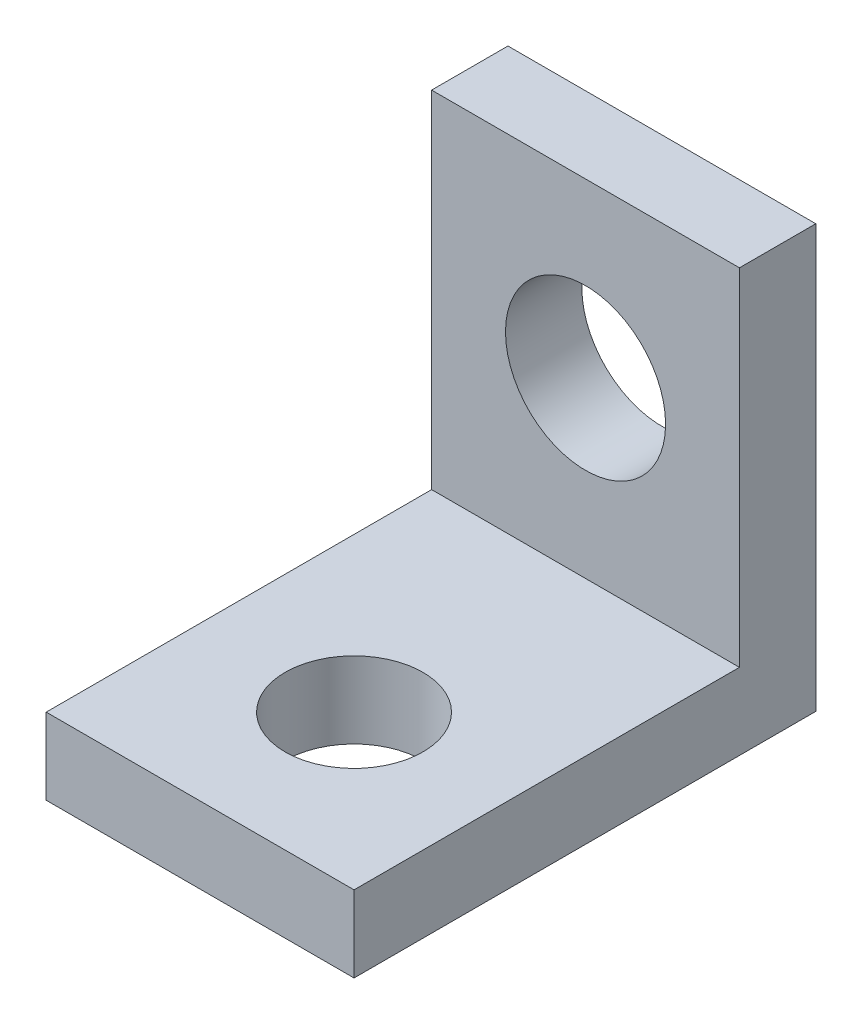
ISO-10303-21;
HEADER;
FILE_DESCRIPTION(('STEP AP214'),'2;1');
FILE_NAME('part.step','',(''),(''),'','','');
FILE_SCHEMA(('AUTOMOTIVE_DESIGN { 1 0 10303 214 1 1 1 1 }'));
ENDSEC;
DATA;
#1=APPLICATION_CONTEXT('core data for automotive mechanical design processes');
#2=APPLICATION_PROTOCOL_DEFINITION('international standard','automotive_design',2000,#1);
#3=PRODUCT_CONTEXT('',#1,'mechanical');
#4=PRODUCT('Part','Part','',(#3));
#5=PRODUCT_RELATED_PRODUCT_CATEGORY('part','',(#4));
#6=PRODUCT_DEFINITION_FORMATION('','',#4);
#7=PRODUCT_DEFINITION_CONTEXT('part definition',#1,'design');
#8=PRODUCT_DEFINITION('design','',#6,#7);
#9=PRODUCT_DEFINITION_SHAPE('','',#8);
#10=(LENGTH_UNIT() NAMED_UNIT(*) SI_UNIT(.MILLI.,.METRE.));
#11=(NAMED_UNIT(*) PLANE_ANGLE_UNIT() SI_UNIT($,.RADIAN.));
#12=(NAMED_UNIT(*) SI_UNIT($,.STERADIAN.) SOLID_ANGLE_UNIT());
#13=UNCERTAINTY_MEASURE_WITH_UNIT(LENGTH_MEASURE(1.E-05),#10,'distance_accuracy_value','');
#14=(GEOMETRIC_REPRESENTATION_CONTEXT(3) GLOBAL_UNCERTAINTY_ASSIGNED_CONTEXT((#13)) GLOBAL_UNIT_ASSIGNED_CONTEXT((#10,
#11,#12)) REPRESENTATION_CONTEXT('',''));
#15=CARTESIAN_POINT('',(0.,0.,0.));
#16=DIRECTION('',(0.,0.,1.));
#17=DIRECTION('',(1.,0.,0.));
#18=AXIS2_PLACEMENT_3D('',#15,#16,#17);
#19=CARTESIAN_POINT('',(-6.35,0.,9.525));
#20=DIRECTION('',(0.,-1.,0.));
#21=DIRECTION('',(0.,0.,-1.));
#22=AXIS2_PLACEMENT_3D('',#19,#20,#21);
#23=PLANE('',#22);
#24=CARTESIAN_POINT('',(-3.175,0.,6.35));
#25=DIRECTION('',(0.,-1.,0.));
#26=DIRECTION('',(0.,0.,-1.));
#27=AXIS2_PLACEMENT_3D('',#24,#25,#26);
#28=CIRCLE('',#27,1.4224);
#29=CARTESIAN_POINT('',(-3.175,0.,7.7724));
#30=VERTEX_POINT('',#29);
#31=EDGE_CURVE('E176',#30,#30,#28,.F.);
#32=ORIENTED_EDGE('',*,*,#31,.T.);
#33=EDGE_LOOP('',(#32));
#34=FACE_BOUND('',#33,.T.);
#35=DIRECTION('',(0.,0.,-1.));
#36=VECTOR('',#35,1.);
#37=CARTESIAN_POINT('',(0.,0.,9.525));
#38=LINE('',#37,#36);
#39=CARTESIAN_POINT('',(0.,0.,9.525));
#40=VERTEX_POINT('',#39);
#41=CARTESIAN_POINT('',(0.,0.,0.));
#42=VERTEX_POINT('',#41);
#43=EDGE_CURVE('E120',#40,#42,#38,.T.);
#44=ORIENTED_EDGE('',*,*,#43,.F.);
#45=DIRECTION('',(1.,0.,0.));
#46=VECTOR('',#45,1.);
#47=CARTESIAN_POINT('',(-6.35,0.,9.525));
#48=LINE('',#47,#46);
#49=CARTESIAN_POINT('',(-6.35,0.,9.525));
#50=VERTEX_POINT('',#49);
#51=EDGE_CURVE('E11',#50,#40,#48,.T.);
#52=ORIENTED_EDGE('',*,*,#51,.F.);
#53=DIRECTION('',(0.,0.,-1.));
#54=VECTOR('',#53,1.);
#55=CARTESIAN_POINT('',(-6.35,0.,9.525));
#56=LINE('',#55,#54);
#57=CARTESIAN_POINT('',(-6.35,0.,0.));
#58=VERTEX_POINT('',#57);
#59=EDGE_CURVE('E135',#50,#58,#56,.T.);
#60=ORIENTED_EDGE('',*,*,#59,.T.);
#61=DIRECTION('',(1.,0.,0.));
#62=VECTOR('',#61,1.);
#63=CARTESIAN_POINT('',(-6.35,0.,0.));
#64=LINE('',#63,#62);
#65=EDGE_CURVE('E38',#58,#42,#64,.T.);
#66=ORIENTED_EDGE('',*,*,#65,.T.);
#67=EDGE_LOOP('',(#44,#52,#60,#66));
#68=FACE_BOUND('',#67,.T.);
#69=ADVANCED_FACE('F35',(#34,#68),#23,.T.);
#70=CARTESIAN_POINT('',(-6.35,1.5748,9.525));
#71=DIRECTION('',(0.,0.,1.));
#72=DIRECTION('',(1.,0.,0.));
#73=AXIS2_PLACEMENT_3D('',#70,#71,#72);
#74=PLANE('',#73);
#75=DIRECTION('',(0.,-1.,0.));
#76=VECTOR('',#75,1.);
#77=CARTESIAN_POINT('',(0.,1.5748,9.525));
#78=LINE('',#77,#76);
#79=CARTESIAN_POINT('',(0.,1.5748,9.525));
#80=VERTEX_POINT('',#79);
#81=EDGE_CURVE('E133',#80,#40,#78,.T.);
#82=ORIENTED_EDGE('',*,*,#81,.F.);
#83=DIRECTION('',(1.,0.,0.));
#84=VECTOR('',#83,1.);
#85=CARTESIAN_POINT('',(-6.35,1.5748,9.525));
#86=LINE('',#85,#84);
#87=CARTESIAN_POINT('',(-6.35,1.5748,9.525));
#88=VERTEX_POINT('',#87);
#89=EDGE_CURVE('E44',#88,#80,#86,.T.);
#90=ORIENTED_EDGE('',*,*,#89,.F.);
#91=DIRECTION('',(0.,-1.,0.));
#92=VECTOR('',#91,1.);
#93=CARTESIAN_POINT('',(-6.35,1.5748,9.525));
#94=LINE('',#93,#92);
#95=EDGE_CURVE('E110',#88,#50,#94,.T.);
#96=ORIENTED_EDGE('',*,*,#95,.T.);
#97=ORIENTED_EDGE('',*,*,#51,.T.);
#98=EDGE_LOOP('',(#82,#90,#96,#97));
#99=FACE_BOUND('',#98,.T.);
#100=ADVANCED_FACE('F143',(#99),#74,.T.);
#101=CARTESIAN_POINT('',(-6.35,1.5748,1.5748));
#102=DIRECTION('',(0.,1.,0.));
#103=DIRECTION('',(0.,0.,1.));
#104=AXIS2_PLACEMENT_3D('',#101,#102,#103);
#105=PLANE('',#104);
#106=CARTESIAN_POINT('',(-3.175,1.5748,6.35));
#107=DIRECTION('',(0.,1.,0.));
#108=DIRECTION('',(0.,0.,1.));
#109=AXIS2_PLACEMENT_3D('',#106,#107,#108);
#110=CIRCLE('',#109,1.4224);
#111=CARTESIAN_POINT('',(-3.175,1.5748,7.7724));
#112=VERTEX_POINT('',#111);
#113=EDGE_CURVE('E171',#112,#112,#110,.T.);
#114=ORIENTED_EDGE('',*,*,#113,.F.);
#115=EDGE_LOOP('',(#114));
#116=FACE_BOUND('',#115,.T.);
#117=DIRECTION('',(0.,0.,1.));
#118=VECTOR('',#117,1.);
#119=CARTESIAN_POINT('',(0.,1.5748,1.5748));
#120=LINE('',#119,#118);
#121=CARTESIAN_POINT('',(0.,1.5748,1.5748));
#122=VERTEX_POINT('',#121);
#123=EDGE_CURVE('E97',#122,#80,#120,.T.);
#124=ORIENTED_EDGE('',*,*,#123,.F.);
#125=DIRECTION('',(1.,0.,0.));
#126=VECTOR('',#125,1.);
#127=CARTESIAN_POINT('',(-6.35,1.5748,1.5748));
#128=LINE('',#127,#126);
#129=CARTESIAN_POINT('',(-6.35,1.5748,1.5748));
#130=VERTEX_POINT('',#129);
#131=EDGE_CURVE('E92',#130,#122,#128,.T.);
#132=ORIENTED_EDGE('',*,*,#131,.F.);
#133=DIRECTION('',(0.,0.,1.));
#134=VECTOR('',#133,1.);
#135=CARTESIAN_POINT('',(-6.35,1.5748,1.5748));
#136=LINE('',#135,#134);
#137=EDGE_CURVE('E95',#130,#88,#136,.T.);
#138=ORIENTED_EDGE('',*,*,#137,.T.);
#139=ORIENTED_EDGE('',*,*,#89,.T.);
#140=EDGE_LOOP('',(#124,#132,#138,#139));
#141=FACE_BOUND('',#140,.T.);
#142=ADVANCED_FACE('F94',(#116,#141),#105,.T.);
#143=CARTESIAN_POINT('',(-6.35,8.7122,1.5748));
#144=DIRECTION('',(0.,0.,1.));
#145=DIRECTION('',(0.,-1.,0.));
#146=AXIS2_PLACEMENT_3D('',#143,#144,#145);
#147=PLANE('',#146);
#148=CARTESIAN_POINT('',(-3.175,5.1562,1.5748));
#149=DIRECTION('',(0.,0.,1.));
#150=DIRECTION('',(1.,0.,0.));
#151=AXIS2_PLACEMENT_3D('',#148,#149,#150);
#152=CIRCLE('',#151,1.651);
#153=CARTESIAN_POINT('',(-1.524,5.1562,1.5748));
#154=VERTEX_POINT('',#153);
#155=EDGE_CURVE('E124',#154,#154,#152,.T.);
#156=ORIENTED_EDGE('',*,*,#155,.F.);
#157=EDGE_LOOP('',(#156));
#158=FACE_BOUND('',#157,.T.);
#159=DIRECTION('',(0.,-1.,0.));
#160=VECTOR('',#159,1.);
#161=CARTESIAN_POINT('',(0.,8.7122,1.5748));
#162=LINE('',#161,#160);
#163=CARTESIAN_POINT('',(0.,8.7122,1.5748));
#164=VERTEX_POINT('',#163);
#165=EDGE_CURVE('E130',#164,#122,#162,.T.);
#166=ORIENTED_EDGE('',*,*,#165,.F.);
#167=DIRECTION('',(1.,0.,0.));
#168=VECTOR('',#167,1.);
#169=CARTESIAN_POINT('',(-6.35,8.7122,1.5748));
#170=LINE('',#169,#168);
#171=CARTESIAN_POINT('',(-6.35,8.7122,1.5748));
#172=VERTEX_POINT('',#171);
#173=EDGE_CURVE('E102',#172,#164,#170,.T.);
#174=ORIENTED_EDGE('',*,*,#173,.F.);
#175=DIRECTION('',(0.,-1.,0.));
#176=VECTOR('',#175,1.);
#177=CARTESIAN_POINT('',(-6.35,8.7122,1.5748));
#178=LINE('',#177,#176);
#179=EDGE_CURVE('E108',#172,#130,#178,.T.);
#180=ORIENTED_EDGE('',*,*,#179,.T.);
#181=ORIENTED_EDGE('',*,*,#131,.T.);
#182=EDGE_LOOP('',(#166,#174,#180,#181));
#183=FACE_BOUND('',#182,.T.);
#184=ADVANCED_FACE('F112',(#158,#183),#147,.T.);
#185=CARTESIAN_POINT('',(-6.35,8.7122,0.));
#186=DIRECTION('',(0.,1.,0.));
#187=DIRECTION('',(0.,0.,1.));
#188=AXIS2_PLACEMENT_3D('',#185,#186,#187);
#189=PLANE('',#188);
#190=DIRECTION('',(0.,0.,1.));
#191=VECTOR('',#190,1.);
#192=CARTESIAN_POINT('',(0.,8.7122,0.));
#193=LINE('',#192,#191);
#194=CARTESIAN_POINT('',(0.,8.7122,0.));
#195=VERTEX_POINT('',#194);
#196=EDGE_CURVE('E127',#195,#164,#193,.T.);
#197=ORIENTED_EDGE('',*,*,#196,.F.);
#198=DIRECTION('',(1.,0.,0.));
#199=VECTOR('',#198,1.);
#200=CARTESIAN_POINT('',(-6.35,8.7122,0.));
#201=LINE('',#200,#199);
#202=CARTESIAN_POINT('',(-6.35,8.7122,0.));
#203=VERTEX_POINT('',#202);
#204=EDGE_CURVE('E138',#203,#195,#201,.T.);
#205=ORIENTED_EDGE('',*,*,#204,.F.);
#206=DIRECTION('',(0.,0.,1.));
#207=VECTOR('',#206,1.);
#208=CARTESIAN_POINT('',(-6.35,8.7122,0.));
#209=LINE('',#208,#207);
#210=EDGE_CURVE('E113',#203,#172,#209,.T.);
#211=ORIENTED_EDGE('',*,*,#210,.T.);
#212=ORIENTED_EDGE('',*,*,#173,.T.);
#213=EDGE_LOOP('',(#197,#205,#211,#212));
#214=FACE_BOUND('',#213,.T.);
#215=ADVANCED_FACE('F158',(#214),#189,.T.);
#216=CARTESIAN_POINT('',(-6.35,0.,0.));
#217=DIRECTION('',(0.,0.,-1.));
#218=DIRECTION('',(-1.,0.,0.));
#219=AXIS2_PLACEMENT_3D('',#216,#217,#218);
#220=PLANE('',#219);
#221=CARTESIAN_POINT('',(-3.175,5.1562,0.));
#222=DIRECTION('',(0.,0.,-1.));
#223=DIRECTION('',(-1.,0.,0.));
#224=AXIS2_PLACEMENT_3D('',#221,#222,#223);
#225=CIRCLE('',#224,1.651);
#226=CARTESIAN_POINT('',(-4.826,5.1562,0.));
#227=VERTEX_POINT('',#226);
#228=EDGE_CURVE('E169',#227,#227,#225,.F.);
#229=ORIENTED_EDGE('',*,*,#228,.T.);
#230=EDGE_LOOP('',(#229));
#231=FACE_BOUND('',#230,.T.);
#232=DIRECTION('',(0.,1.,0.));
#233=VECTOR('',#232,1.);
#234=CARTESIAN_POINT('',(0.,0.,0.));
#235=LINE('',#234,#233);
#236=EDGE_CURVE('E123',#42,#195,#235,.T.);
#237=ORIENTED_EDGE('',*,*,#236,.F.);
#238=ORIENTED_EDGE('',*,*,#65,.F.);
#239=DIRECTION('',(0.,1.,0.));
#240=VECTOR('',#239,1.);
#241=CARTESIAN_POINT('',(-6.35,0.,0.));
#242=LINE('',#241,#240);
#243=EDGE_CURVE('E115',#58,#203,#242,.T.);
#244=ORIENTED_EDGE('',*,*,#243,.T.);
#245=ORIENTED_EDGE('',*,*,#204,.T.);
#246=EDGE_LOOP('',(#237,#238,#244,#245));
#247=FACE_BOUND('',#246,.T.);
#248=ADVANCED_FACE('F140',(#231,#247),#220,.T.);
#249=CARTESIAN_POINT('',(-6.35,0.,0.));
#250=DIRECTION('',(1.,0.,0.));
#251=DIRECTION('',(0.,0.,-1.));
#252=AXIS2_PLACEMENT_3D('',#249,#250,#251);
#253=PLANE('',#252);
#254=ORIENTED_EDGE('',*,*,#59,.F.);
#255=ORIENTED_EDGE('',*,*,#95,.F.);
#256=ORIENTED_EDGE('',*,*,#137,.F.);
#257=ORIENTED_EDGE('',*,*,#179,.F.);
#258=ORIENTED_EDGE('',*,*,#210,.F.);
#259=ORIENTED_EDGE('',*,*,#243,.F.);
#260=EDGE_LOOP('',(#254,#255,#256,#257,#258,#259));
#261=FACE_BOUND('',#260,.T.);
#262=ADVANCED_FACE('F106',(#261),#253,.F.);
#263=CARTESIAN_POINT('',(0.,0.,0.));
#264=DIRECTION('',(1.,0.,0.));
#265=DIRECTION('',(0.,0.,-1.));
#266=AXIS2_PLACEMENT_3D('',#263,#264,#265);
#267=PLANE('',#266);
#268=ORIENTED_EDGE('',*,*,#43,.T.);
#269=ORIENTED_EDGE('',*,*,#236,.T.);
#270=ORIENTED_EDGE('',*,*,#196,.T.);
#271=ORIENTED_EDGE('',*,*,#165,.T.);
#272=ORIENTED_EDGE('',*,*,#123,.T.);
#273=ORIENTED_EDGE('',*,*,#81,.T.);
#274=EDGE_LOOP('',(#268,#269,#270,#271,#272,#273));
#275=FACE_BOUND('',#274,.T.);
#276=ADVANCED_FACE('F142',(#275),#267,.T.);
#277=CARTESIAN_POINT('',(-3.175,5.1562,-0.000999999999999916));
#278=DIRECTION('',(0.,0.,1.));
#279=DIRECTION('',(1.,0.,0.));
#280=AXIS2_PLACEMENT_3D('',#277,#278,#279);
#281=CYLINDRICAL_SURFACE('',#280,1.651);
#282=ORIENTED_EDGE('',*,*,#228,.F.);
#283=EDGE_LOOP('',(#282));
#284=FACE_BOUND('',#283,.T.);
#285=ORIENTED_EDGE('',*,*,#155,.T.);
#286=EDGE_LOOP('',(#285));
#287=FACE_BOUND('',#286,.T.);
#288=ADVANCED_FACE('F186',(#284,#287),#281,.F.);
#289=CARTESIAN_POINT('',(-3.175,-0.00100000000000078,6.35));
#290=DIRECTION('',(0.,1.,0.));
#291=DIRECTION('',(0.,0.,1.));
#292=AXIS2_PLACEMENT_3D('',#289,#290,#291);
#293=CYLINDRICAL_SURFACE('',#292,1.4224);
#294=CARTESIAN_POINT('',(-3.175,0.,7.7724));
#295=CARTESIAN_POINT('',(-3.175,0.0164041666666667,7.7724));
#296=CARTESIAN_POINT('',(-3.175,0.0328083333333333,7.7724));
#297=CARTESIAN_POINT('',(-3.175,0.0656166666666667,7.7724));
#298=CARTESIAN_POINT('',(-3.175,0.0820208333333333,7.7724));
#299=CARTESIAN_POINT('',(-3.175,0.114829166666667,7.7724));
#300=CARTESIAN_POINT('',(-3.175,0.131233333333333,7.7724));
#301=CARTESIAN_POINT('',(-3.175,0.164041666666667,7.7724));
#302=CARTESIAN_POINT('',(-3.175,0.180445833333333,7.7724));
#303=CARTESIAN_POINT('',(-3.175,0.213254166666667,7.7724));
#304=CARTESIAN_POINT('',(-3.175,0.229658333333333,7.7724));
#305=CARTESIAN_POINT('',(-3.175,0.262466666666667,7.7724));
#306=CARTESIAN_POINT('',(-3.175,0.278870833333333,7.7724));
#307=CARTESIAN_POINT('',(-3.175,0.311679166666667,7.7724));
#308=CARTESIAN_POINT('',(-3.175,0.328083333333333,7.7724));
#309=CARTESIAN_POINT('',(-3.175,0.360891666666667,7.7724));
#310=CARTESIAN_POINT('',(-3.175,0.377295833333333,7.7724));
#311=CARTESIAN_POINT('',(-3.175,0.410104166666667,7.7724));
#312=CARTESIAN_POINT('',(-3.175,0.426508333333333,7.7724));
#313=CARTESIAN_POINT('',(-3.175,0.459316666666667,7.7724));
#314=CARTESIAN_POINT('',(-3.175,0.475720833333333,7.7724));
#315=CARTESIAN_POINT('',(-3.175,0.508529166666667,7.7724));
#316=CARTESIAN_POINT('',(-3.175,0.524933333333333,7.7724));
#317=CARTESIAN_POINT('',(-3.175,0.557741666666667,7.7724));
#318=CARTESIAN_POINT('',(-3.175,0.574145833333333,7.7724));
#319=CARTESIAN_POINT('',(-3.175,0.606954166666667,7.7724));
#320=CARTESIAN_POINT('',(-3.175,0.623358333333333,7.7724));
#321=CARTESIAN_POINT('',(-3.175,0.656166666666667,7.7724));
#322=CARTESIAN_POINT('',(-3.175,0.672570833333333,7.7724));
#323=CARTESIAN_POINT('',(-3.175,0.705379166666667,7.7724));
#324=CARTESIAN_POINT('',(-3.175,0.721783333333333,7.7724));
#325=CARTESIAN_POINT('',(-3.175,0.754591666666667,7.7724));
#326=CARTESIAN_POINT('',(-3.175,0.770995833333333,7.7724));
#327=CARTESIAN_POINT('',(-3.175,0.803804166666667,7.7724));
#328=CARTESIAN_POINT('',(-3.175,0.820208333333333,7.7724));
#329=CARTESIAN_POINT('',(-3.175,0.853016666666667,7.7724));
#330=CARTESIAN_POINT('',(-3.175,0.869420833333333,7.7724));
#331=CARTESIAN_POINT('',(-3.175,0.902229166666667,7.7724));
#332=CARTESIAN_POINT('',(-3.175,0.918633333333333,7.7724));
#333=CARTESIAN_POINT('',(-3.175,0.951441666666667,7.7724));
#334=CARTESIAN_POINT('',(-3.175,0.967845833333333,7.7724));
#335=CARTESIAN_POINT('',(-3.175,1.00065416666667,7.7724));
#336=CARTESIAN_POINT('',(-3.175,1.01705833333333,7.7724));
#337=CARTESIAN_POINT('',(-3.175,1.04986666666667,7.7724));
#338=CARTESIAN_POINT('',(-3.175,1.06627083333333,7.7724));
#339=CARTESIAN_POINT('',(-3.175,1.09907916666667,7.7724));
#340=CARTESIAN_POINT('',(-3.175,1.11548333333333,7.7724));
#341=CARTESIAN_POINT('',(-3.175,1.14829166666667,7.7724));
#342=CARTESIAN_POINT('',(-3.175,1.16469583333333,7.7724));
#343=CARTESIAN_POINT('',(-3.175,1.19750416666667,7.7724));
#344=CARTESIAN_POINT('',(-3.175,1.21390833333333,7.7724));
#345=CARTESIAN_POINT('',(-3.175,1.24671666666667,7.7724));
#346=CARTESIAN_POINT('',(-3.175,1.26312083333333,7.7724));
#347=CARTESIAN_POINT('',(-3.175,1.29592916666667,7.7724));
#348=CARTESIAN_POINT('',(-3.175,1.31233333333333,7.7724));
#349=CARTESIAN_POINT('',(-3.175,1.34514166666667,7.7724));
#350=CARTESIAN_POINT('',(-3.175,1.36154583333333,7.7724));
#351=CARTESIAN_POINT('',(-3.175,1.39435416666667,7.7724));
#352=CARTESIAN_POINT('',(-3.175,1.41075833333333,7.7724));
#353=CARTESIAN_POINT('',(-3.175,1.44356666666667,7.7724));
#354=CARTESIAN_POINT('',(-3.175,1.45997083333333,7.7724));
#355=CARTESIAN_POINT('',(-3.175,1.49277916666667,7.7724));
#356=CARTESIAN_POINT('',(-3.175,1.50918333333333,7.7724));
#357=CARTESIAN_POINT('',(-3.175,1.54199166666667,7.7724));
#358=CARTESIAN_POINT('',(-3.175,1.55839583333333,7.7724));
#359=CARTESIAN_POINT('',(-3.175,1.5748,7.7724));
#360=B_SPLINE_CURVE_WITH_KNOTS('',3,(#294,#295,#296,#297,#298,#299,#300,#301,#302,#303,#304,
#305,#306,#307,#308,#309,#310,#311,#312,#313,#314,#315,#316,#317,#318,#319,#320,#321,#322,#323,
#324,#325,#326,#327,#328,#329,#330,#331,#332,#333,#334,#335,#336,#337,#338,#339,#340,#341,#342,
#343,#344,#345,#346,#347,#348,#349,#350,#351,#352,#353,#354,#355,#356,#357,#358,#359),
.UNSPECIFIED.,.F.,.F.,(4,2,2,2,2,2,2,2,2,2,2,2,2,2,2,2,2,2,2,2,2,2,2,2,2,2,2,2,2,2,2,2,4),(0.,
0.0492125,0.098425,0.1476375,0.19685,0.2460625,0.295275,0.3444875,0.3937,0.4429125,0.492125,
0.5413375,0.59055,0.6397625,0.688975,0.7381875,0.7874,0.8366125,0.885825,0.9350375,0.98425,
1.0334625,1.082675,1.1318875,1.1811,1.2303125,1.279525,1.3287375,1.37795,1.4271625,1.476375,
1.5255875,1.5748),.UNSPECIFIED.);
#361=EDGE_CURVE('BSEAM183',#30,#112,#360,.T.);
#362=ORIENTED_EDGE('',*,*,#31,.F.);
#363=ORIENTED_EDGE('',*,*,#113,.T.);
#364=ORIENTED_EDGE('',*,*,#361,.T.);
#365=ORIENTED_EDGE('',*,*,#361,.F.);
#366=EDGE_LOOP('',(#362,#364,#363,#365));
#367=FACE_BOUND('',#366,.T.);
#368=ADVANCED_FACE('F183',(#367),#293,.F.);
#369=CLOSED_SHELL('',(#69,#100,#142,#184,#215,#248,#262,#276,#288,#368));
#370=MANIFOLD_SOLID_BREP('B2',#369);
#371=ADVANCED_BREP_SHAPE_REPRESENTATION('',(#18,#370),#14);
#372=SHAPE_DEFINITION_REPRESENTATION(#9,#371);
ENDSEC;
END-ISO-10303-21;
